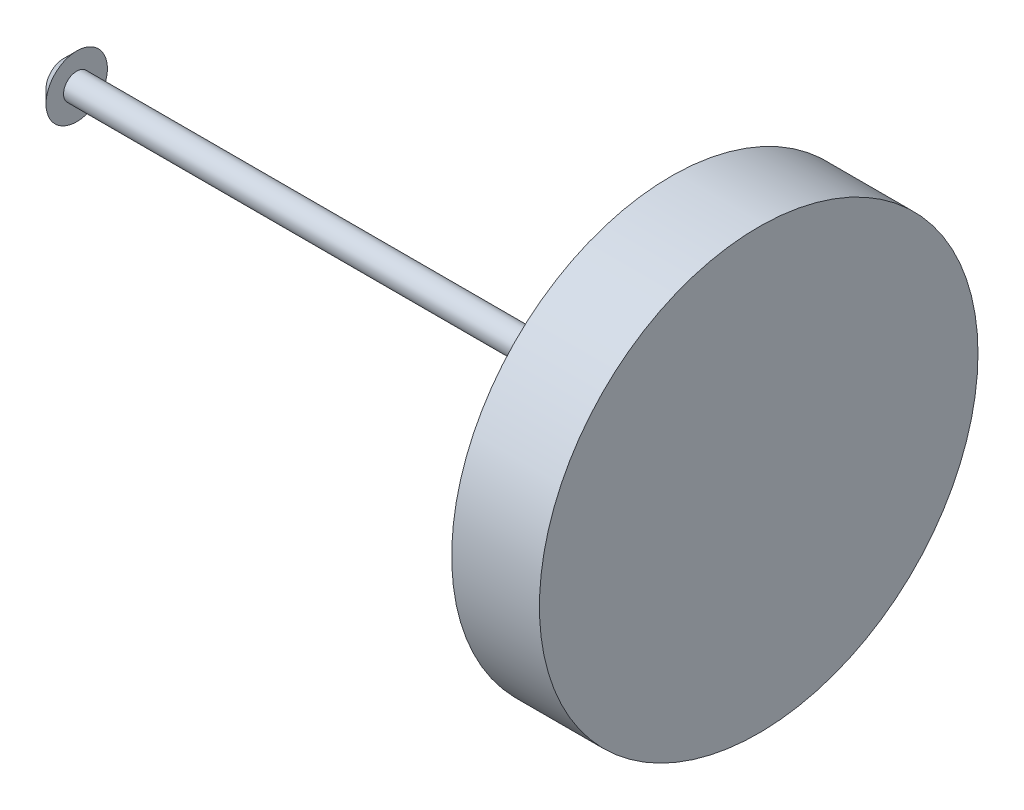
ISO-10303-21;
HEADER;
FILE_DESCRIPTION(('STEP AP214'),'2;1');
FILE_NAME('part.step','',(''),(''),'','','');
FILE_SCHEMA(('AUTOMOTIVE_DESIGN { 1 0 10303 214 1 1 1 1 }'));
ENDSEC;
DATA;
#1=APPLICATION_CONTEXT('core data for automotive mechanical design processes');
#2=APPLICATION_PROTOCOL_DEFINITION('international standard','automotive_design',2000,#1);
#3=PRODUCT_CONTEXT('',#1,'mechanical');
#4=PRODUCT('Part','Part','',(#3));
#5=PRODUCT_RELATED_PRODUCT_CATEGORY('part','',(#4));
#6=PRODUCT_DEFINITION_FORMATION('','',#4);
#7=PRODUCT_DEFINITION_CONTEXT('part definition',#1,'design');
#8=PRODUCT_DEFINITION('design','',#6,#7);
#9=PRODUCT_DEFINITION_SHAPE('','',#8);
#10=(LENGTH_UNIT() NAMED_UNIT(*) SI_UNIT(.MILLI.,.METRE.));
#11=(NAMED_UNIT(*) PLANE_ANGLE_UNIT() SI_UNIT($,.RADIAN.));
#12=(NAMED_UNIT(*) SI_UNIT($,.STERADIAN.) SOLID_ANGLE_UNIT());
#13=UNCERTAINTY_MEASURE_WITH_UNIT(LENGTH_MEASURE(1.E-05),#10,'distance_accuracy_value','');
#14=(GEOMETRIC_REPRESENTATION_CONTEXT(3) GLOBAL_UNCERTAINTY_ASSIGNED_CONTEXT((#13)) GLOBAL_UNIT_ASSIGNED_CONTEXT((#10,
#11,#12)) REPRESENTATION_CONTEXT('',''));
#15=CARTESIAN_POINT('',(0.,0.,0.));
#16=DIRECTION('',(0.,0.,1.));
#17=DIRECTION('',(1.,0.,0.));
#18=AXIS2_PLACEMENT_3D('',#15,#16,#17);
#19=CARTESIAN_POINT('',(99.9999999999999,0.,-125.));
#20=DIRECTION('',(-1.,0.,0.));
#21=DIRECTION('',(0.,0.,1.));
#22=AXIS2_PLACEMENT_3D('',#19,#20,#21);
#23=CYLINDRICAL_SURFACE('',#22,1.5);
#24=CARTESIAN_POINT('',(99.9999999999999,0.,-125.));
#25=DIRECTION('',(1.,0.,0.));
#26=DIRECTION('',(0.,0.,-1.));
#27=AXIS2_PLACEMENT_3D('',#24,#25,#26);
#28=CIRCLE('',#27,1.5);
#29=CARTESIAN_POINT('',(99.9999999999999,0.,-126.5));
#30=VERTEX_POINT('',#29);
#31=EDGE_CURVE('E11',#30,#30,#28,.T.);
#32=ORIENTED_EDGE('',*,*,#31,.F.);
#33=EDGE_LOOP('',(#32));
#34=FACE_BOUND('',#33,.T.);
#35=CARTESIAN_POINT('',(32.2499999999999,0.,-125.));
#36=DIRECTION('',(-1.,0.,0.));
#37=DIRECTION('',(0.,0.,1.));
#38=AXIS2_PLACEMENT_3D('',#35,#36,#37);
#39=CIRCLE('',#38,1.5);
#40=CARTESIAN_POINT('',(32.2499999999999,0.,-123.5));
#41=VERTEX_POINT('',#40);
#42=EDGE_CURVE('E61',#41,#41,#39,.T.);
#43=ORIENTED_EDGE('',*,*,#42,.F.);
#44=EDGE_LOOP('',(#43));
#45=FACE_BOUND('',#44,.T.);
#46=ADVANCED_FACE('F46',(#34,#45),#23,.T.);
#47=CARTESIAN_POINT('',(110.,0.,-125.));
#48=DIRECTION('',(-1.,0.,0.));
#49=DIRECTION('',(0.,0.,1.));
#50=AXIS2_PLACEMENT_3D('',#47,#48,#49);
#51=CYLINDRICAL_SURFACE('',#50,25.);
#52=CARTESIAN_POINT('',(110.,0.,-125.));
#53=DIRECTION('',(1.,0.,0.));
#54=DIRECTION('',(0.,0.,-1.));
#55=AXIS2_PLACEMENT_3D('',#52,#53,#54);
#56=CIRCLE('',#55,25.);
#57=CARTESIAN_POINT('',(110.,0.,-150.));
#58=VERTEX_POINT('',#57);
#59=EDGE_CURVE('E52',#58,#58,#56,.T.);
#60=ORIENTED_EDGE('',*,*,#59,.F.);
#61=EDGE_LOOP('',(#60));
#62=FACE_BOUND('',#61,.T.);
#63=CARTESIAN_POINT('',(99.9999999999999,0.,-125.));
#64=DIRECTION('',(1.,0.,0.));
#65=DIRECTION('',(0.,0.,-1.));
#66=AXIS2_PLACEMENT_3D('',#63,#64,#65);
#67=CIRCLE('',#66,25.);
#68=CARTESIAN_POINT('',(99.9999999999999,0.,-150.));
#69=VERTEX_POINT('',#68);
#70=EDGE_CURVE('E56',#69,#69,#67,.T.);
#71=ORIENTED_EDGE('',*,*,#70,.T.);
#72=EDGE_LOOP('',(#71));
#73=FACE_BOUND('',#72,.T.);
#74=ADVANCED_FACE('F97',(#62,#73),#51,.T.);
#75=CARTESIAN_POINT('',(110.,0.,-125.));
#76=DIRECTION('',(1.,0.,0.));
#77=DIRECTION('',(0.,0.,-1.));
#78=AXIS2_PLACEMENT_3D('',#75,#76,#77);
#79=PLANE('',#78);
#80=ORIENTED_EDGE('',*,*,#59,.T.);
#81=EDGE_LOOP('',(#80));
#82=FACE_BOUND('',#81,.T.);
#83=ADVANCED_FACE('F103',(#82),#79,.T.);
#84=CARTESIAN_POINT('',(99.9999999999999,0.,-125.));
#85=DIRECTION('',(1.,0.,0.));
#86=DIRECTION('',(0.,0.,-1.));
#87=AXIS2_PLACEMENT_3D('',#84,#85,#86);
#88=PLANE('',#87);
#89=ORIENTED_EDGE('',*,*,#31,.T.);
#90=EDGE_LOOP('',(#89));
#91=FACE_BOUND('',#90,.T.);
#92=ORIENTED_EDGE('',*,*,#70,.F.);
#93=EDGE_LOOP('',(#92));
#94=FACE_BOUND('',#93,.T.);
#95=ADVANCED_FACE('F93',(#91,#94),#88,.F.);
#96=CARTESIAN_POINT('',(32.2499999999999,0.,-121.5));
#97=DIRECTION('',(1.,0.,0.));
#98=DIRECTION('',(0.,0.,-1.));
#99=AXIS2_PLACEMENT_3D('',#96,#97,#98);
#100=PLANE('',#99);
#101=ORIENTED_EDGE('',*,*,#42,.T.);
#102=EDGE_LOOP('',(#101));
#103=FACE_BOUND('',#102,.T.);
#104=CARTESIAN_POINT('',(32.2499999999999,0.,-125.));
#105=DIRECTION('',(-1.,0.,0.));
#106=DIRECTION('',(0.,0.,1.));
#107=AXIS2_PLACEMENT_3D('',#104,#105,#106);
#108=CIRCLE('',#107,3.5);
#109=CARTESIAN_POINT('',(32.2499999999999,0.,-121.5));
#110=VERTEX_POINT('',#109);
#111=EDGE_CURVE('E69',#110,#110,#108,.T.);
#112=ORIENTED_EDGE('',*,*,#111,.F.);
#113=EDGE_LOOP('',(#112));
#114=FACE_BOUND('',#113,.T.);
#115=ADVANCED_FACE('F84',(#103,#114),#100,.T.);
#116=CARTESIAN_POINT('',(31.7499999999999,1.00000000000001,-125.));
#117=DIRECTION('',(-1.,0.,0.));
#118=DIRECTION('',(0.,0.,1.));
#119=AXIS2_PLACEMENT_3D('',#116,#117,#118);
#120=PLANE('',#119);
#121=CARTESIAN_POINT('',(31.7499999999999,1.00000000000001,-125.));
#122=DIRECTION('',(-1.,0.,0.));
#123=DIRECTION('',(0.,0.,1.));
#124=AXIS2_PLACEMENT_3D('',#121,#122,#123);
#125=CIRCLE('',#124,0.25);
#126=CARTESIAN_POINT('',(31.7499999999999,1.00000000000001,-124.75));
#127=VERTEX_POINT('',#126);
#128=EDGE_CURVE('E66',#127,#127,#125,.T.);
#129=ORIENTED_EDGE('',*,*,#128,.T.);
#130=EDGE_LOOP('',(#129));
#131=FACE_BOUND('',#130,.T.);
#132=ADVANCED_FACE('F92',(#131),#120,.T.);
#133=CARTESIAN_POINT('',(31.7499999999999,1.00000000000001,-125.));
#134=DIRECTION('',(-1.,0.,0.));
#135=DIRECTION('',(0.,0.,1.));
#136=AXIS2_PLACEMENT_3D('',#133,#134,#135);
#137=CYLINDRICAL_SURFACE('',#136,0.25);
#138=ORIENTED_EDGE('',*,*,#128,.F.);
#139=EDGE_LOOP('',(#138));
#140=FACE_BOUND('',#139,.T.);
#141=CARTESIAN_POINT('',(30.7499999999999,1.00000000000001,-125.));
#142=DIRECTION('',(-1.,0.,0.));
#143=DIRECTION('',(0.,0.,1.));
#144=AXIS2_PLACEMENT_3D('',#141,#142,#143);
#145=CIRCLE('',#144,0.25);
#146=CARTESIAN_POINT('',(30.7499999999999,1.00000000000001,-124.75));
#147=VERTEX_POINT('',#146);
#148=EDGE_CURVE('E65',#147,#147,#145,.T.);
#149=ORIENTED_EDGE('',*,*,#148,.T.);
#150=EDGE_LOOP('',(#149));
#151=FACE_BOUND('',#150,.T.);
#152=ADVANCED_FACE('F87',(#140,#151),#137,.F.);
#153=CARTESIAN_POINT('',(30.7499999999999,0.,-125.));
#154=DIRECTION('',(1.,0.,0.));
#155=DIRECTION('',(0.,0.,-1.));
#156=AXIS2_PLACEMENT_3D('',#153,#154,#155);
#157=PLANE('',#156);
#158=ORIENTED_EDGE('',*,*,#148,.F.);
#159=EDGE_LOOP('',(#158));
#160=FACE_BOUND('',#159,.T.);
#161=CARTESIAN_POINT('',(30.7499999999999,0.,-125.));
#162=DIRECTION('',(-1.,0.,0.));
#163=DIRECTION('',(0.,0.,1.));
#164=AXIS2_PLACEMENT_3D('',#161,#162,#163);
#165=CIRCLE('',#164,2.00000000000003);
#166=CARTESIAN_POINT('',(30.7499999999999,0.,-123.));
#167=VERTEX_POINT('',#166);
#168=EDGE_CURVE('E74',#167,#167,#165,.T.);
#169=ORIENTED_EDGE('',*,*,#168,.T.);
#170=EDGE_LOOP('',(#169));
#171=FACE_BOUND('',#170,.T.);
#172=ADVANCED_FACE('F78',(#160,#171),#157,.F.);
#173=CARTESIAN_POINT('',(30.7499999999999,0.,-125.));
#174=DIRECTION('',(1.,0.,0.));
#175=DIRECTION('',(0.,0.,-1.));
#176=AXIS2_PLACEMENT_3D('',#173,#174,#175);
#177=CONICAL_SURFACE('',#176,2.00000000000003,0.785398163397439);
#178=ORIENTED_EDGE('',*,*,#111,.T.);
#179=EDGE_LOOP('',(#178));
#180=FACE_BOUND('',#179,.T.);
#181=ORIENTED_EDGE('',*,*,#168,.F.);
#182=EDGE_LOOP('',(#181));
#183=FACE_BOUND('',#182,.T.);
#184=ADVANCED_FACE('F80',(#180,#183),#177,.T.);
#185=CLOSED_SHELL('',(#46,#74,#83,#95,#115,#132,#152,#172,#184));
#186=MANIFOLD_SOLID_BREP('B2',#185);
#187=ADVANCED_BREP_SHAPE_REPRESENTATION('',(#18,#186),#14);
#188=SHAPE_DEFINITION_REPRESENTATION(#9,#187);
ENDSEC;
END-ISO-10303-21;
